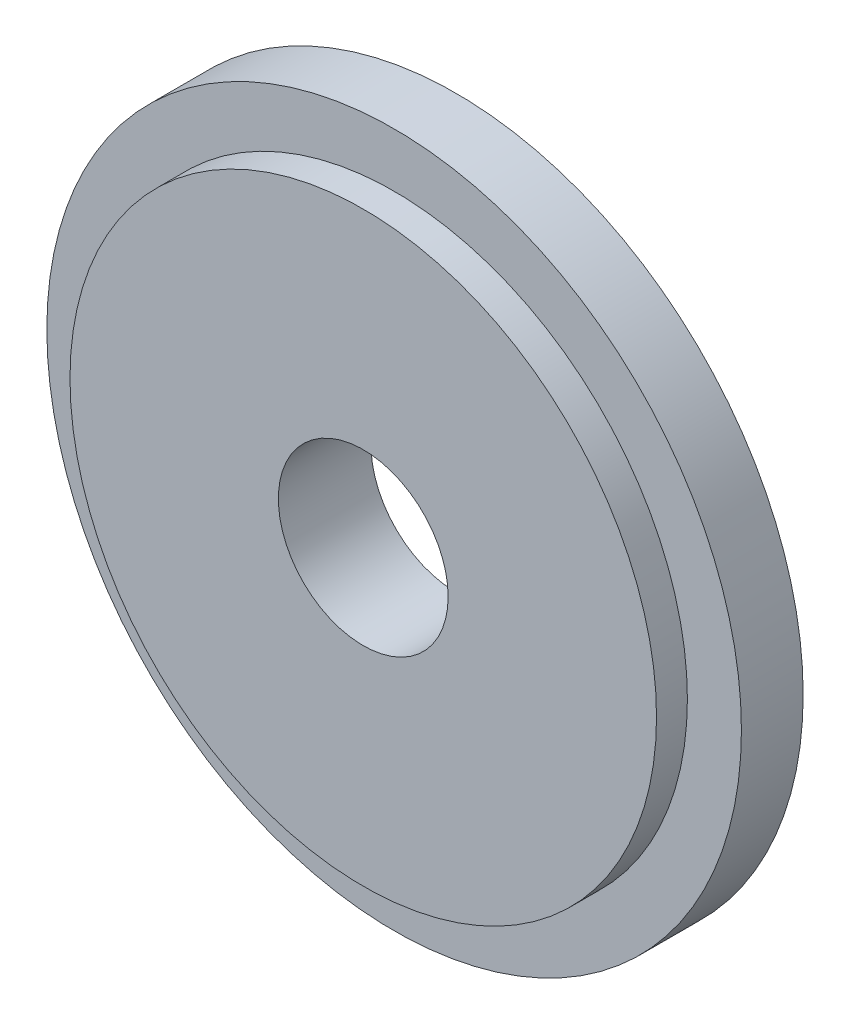
ISO-10303-21;
HEADER;
FILE_DESCRIPTION(('STEP AP214'),'2;1');
FILE_NAME('part.step','',(''),(''),'','','');
FILE_SCHEMA(('AUTOMOTIVE_DESIGN { 1 0 10303 214 1 1 1 1 }'));
ENDSEC;
DATA;
#1=APPLICATION_CONTEXT('core data for automotive mechanical design processes');
#2=APPLICATION_PROTOCOL_DEFINITION('international standard','automotive_design',2000,#1);
#3=PRODUCT_CONTEXT('',#1,'mechanical');
#4=PRODUCT('Part','Part','',(#3));
#5=PRODUCT_RELATED_PRODUCT_CATEGORY('part','',(#4));
#6=PRODUCT_DEFINITION_FORMATION('','',#4);
#7=PRODUCT_DEFINITION_CONTEXT('part definition',#1,'design');
#8=PRODUCT_DEFINITION('design','',#6,#7);
#9=PRODUCT_DEFINITION_SHAPE('','',#8);
#10=(LENGTH_UNIT() NAMED_UNIT(*) SI_UNIT(.MILLI.,.METRE.));
#11=(NAMED_UNIT(*) PLANE_ANGLE_UNIT() SI_UNIT($,.RADIAN.));
#12=(NAMED_UNIT(*) SI_UNIT($,.STERADIAN.) SOLID_ANGLE_UNIT());
#13=UNCERTAINTY_MEASURE_WITH_UNIT(LENGTH_MEASURE(1.E-05),#10,'distance_accuracy_value','');
#14=(GEOMETRIC_REPRESENTATION_CONTEXT(3) GLOBAL_UNCERTAINTY_ASSIGNED_CONTEXT((#13)) GLOBAL_UNIT_ASSIGNED_CONTEXT((#10,
#11,#12)) REPRESENTATION_CONTEXT('',''));
#15=CARTESIAN_POINT('',(0.,0.,0.));
#16=DIRECTION('',(0.,0.,1.));
#17=DIRECTION('',(1.,0.,0.));
#18=AXIS2_PLACEMENT_3D('',#15,#16,#17);
#19=CARTESIAN_POINT('',(0.,0.,4.));
#20=DIRECTION('',(0.,0.,1.));
#21=DIRECTION('',(1.,0.,0.));
#22=AXIS2_PLACEMENT_3D('',#19,#20,#21);
#23=PLANE('',#22);
#24=CARTESIAN_POINT('',(0.,0.,4.));
#25=DIRECTION('',(0.,0.,1.));
#26=DIRECTION('',(1.,0.,0.));
#27=AXIS2_PLACEMENT_3D('',#24,#25,#26);
#28=CIRCLE('',#27,22.5);
#29=CARTESIAN_POINT('',(22.5,0.,4.));
#30=VERTEX_POINT('',#29);
#31=EDGE_CURVE('E10',#30,#30,#28,.T.);
#32=ORIENTED_EDGE('',*,*,#31,.T.);
#33=EDGE_LOOP('',(#32));
#34=FACE_BOUND('',#33,.T.);
#35=CARTESIAN_POINT('',(0.,0.,4.));
#36=DIRECTION('',(0.,0.,1.));
#37=DIRECTION('',(1.,0.,0.));
#38=AXIS2_PLACEMENT_3D('',#35,#36,#37);
#39=CIRCLE('',#38,19.);
#40=CARTESIAN_POINT('',(19.,0.,4.));
#41=VERTEX_POINT('',#40);
#42=EDGE_CURVE('E43',#41,#41,#39,.T.);
#43=ORIENTED_EDGE('',*,*,#42,.F.);
#44=EDGE_LOOP('',(#43));
#45=FACE_BOUND('',#44,.T.);
#46=ADVANCED_FACE('F30',(#34,#45),#23,.T.);
#47=CARTESIAN_POINT('',(0.,0.,4.));
#48=DIRECTION('',(0.,0.,-1.));
#49=DIRECTION('',(-1.,0.,0.));
#50=AXIS2_PLACEMENT_3D('',#47,#48,#49);
#51=CYLINDRICAL_SURFACE('',#50,22.5);
#52=ORIENTED_EDGE('',*,*,#31,.F.);
#53=EDGE_LOOP('',(#52));
#54=FACE_BOUND('',#53,.T.);
#55=CARTESIAN_POINT('',(0.,0.,0.));
#56=DIRECTION('',(0.,0.,1.));
#57=DIRECTION('',(1.,0.,0.));
#58=AXIS2_PLACEMENT_3D('',#55,#56,#57);
#59=CIRCLE('',#58,22.5);
#60=CARTESIAN_POINT('',(22.5,0.,0.));
#61=VERTEX_POINT('',#60);
#62=EDGE_CURVE('E34',#61,#61,#59,.T.);
#63=ORIENTED_EDGE('',*,*,#62,.T.);
#64=EDGE_LOOP('',(#63));
#65=FACE_BOUND('',#64,.T.);
#66=ADVANCED_FACE('F32',(#54,#65),#51,.T.);
#67=CARTESIAN_POINT('',(0.,0.,0.));
#68=DIRECTION('',(0.,0.,1.));
#69=DIRECTION('',(1.,0.,0.));
#70=AXIS2_PLACEMENT_3D('',#67,#68,#69);
#71=PLANE('',#70);
#72=CARTESIAN_POINT('',(0.,0.,0.));
#73=DIRECTION('',(0.,0.,1.));
#74=DIRECTION('',(1.,0.,0.));
#75=AXIS2_PLACEMENT_3D('',#72,#73,#74);
#76=CIRCLE('',#75,5.5);
#77=CARTESIAN_POINT('',(5.5,0.,0.));
#78=VERTEX_POINT('',#77);
#79=EDGE_CURVE('E46',#78,#78,#76,.T.);
#80=ORIENTED_EDGE('',*,*,#79,.T.);
#81=EDGE_LOOP('',(#80));
#82=FACE_BOUND('',#81,.T.);
#83=ORIENTED_EDGE('',*,*,#62,.F.);
#84=EDGE_LOOP('',(#83));
#85=FACE_BOUND('',#84,.T.);
#86=ADVANCED_FACE('F55',(#82,#85),#71,.F.);
#87=CARTESIAN_POINT('',(0.,0.,6.));
#88=DIRECTION('',(0.,0.,-1.));
#89=DIRECTION('',(-1.,0.,0.));
#90=AXIS2_PLACEMENT_3D('',#87,#88,#89);
#91=CYLINDRICAL_SURFACE('',#90,19.);
#92=CARTESIAN_POINT('',(0.,0.,6.));
#93=DIRECTION('',(0.,0.,1.));
#94=DIRECTION('',(1.,0.,0.));
#95=AXIS2_PLACEMENT_3D('',#92,#93,#94);
#96=CIRCLE('',#95,19.);
#97=CARTESIAN_POINT('',(19.,0.,6.));
#98=VERTEX_POINT('',#97);
#99=EDGE_CURVE('E41',#98,#98,#96,.T.);
#100=ORIENTED_EDGE('',*,*,#99,.F.);
#101=EDGE_LOOP('',(#100));
#102=FACE_BOUND('',#101,.T.);
#103=ORIENTED_EDGE('',*,*,#42,.T.);
#104=EDGE_LOOP('',(#103));
#105=FACE_BOUND('',#104,.T.);
#106=ADVANCED_FACE('F67',(#102,#105),#91,.T.);
#107=CARTESIAN_POINT('',(0.,0.,6.));
#108=DIRECTION('',(0.,0.,1.));
#109=DIRECTION('',(1.,0.,0.));
#110=AXIS2_PLACEMENT_3D('',#107,#108,#109);
#111=PLANE('',#110);
#112=CARTESIAN_POINT('',(0.,0.,6.));
#113=DIRECTION('',(0.,0.,1.));
#114=DIRECTION('',(1.,0.,0.));
#115=AXIS2_PLACEMENT_3D('',#112,#113,#114);
#116=CIRCLE('',#115,5.5);
#117=CARTESIAN_POINT('',(5.5,0.,6.));
#118=VERTEX_POINT('',#117);
#119=EDGE_CURVE('E49',#118,#118,#116,.T.);
#120=ORIENTED_EDGE('',*,*,#119,.F.);
#121=EDGE_LOOP('',(#120));
#122=FACE_BOUND('',#121,.T.);
#123=ORIENTED_EDGE('',*,*,#99,.T.);
#124=EDGE_LOOP('',(#123));
#125=FACE_BOUND('',#124,.T.);
#126=ADVANCED_FACE('F61',(#122,#125),#111,.T.);
#127=CARTESIAN_POINT('',(0.,0.,0.));
#128=DIRECTION('',(0.,0.,1.));
#129=DIRECTION('',(1.,0.,0.));
#130=AXIS2_PLACEMENT_3D('',#127,#128,#129);
#131=CYLINDRICAL_SURFACE('',#130,5.5);
#132=ORIENTED_EDGE('',*,*,#79,.F.);
#133=EDGE_LOOP('',(#132));
#134=FACE_BOUND('',#133,.T.);
#135=ORIENTED_EDGE('',*,*,#119,.T.);
#136=EDGE_LOOP('',(#135));
#137=FACE_BOUND('',#136,.T.);
#138=ADVANCED_FACE('F58',(#134,#137),#131,.F.);
#139=CLOSED_SHELL('',(#46,#66,#86,#106,#126,#138));
#140=MANIFOLD_SOLID_BREP('B2',#139);
#141=ADVANCED_BREP_SHAPE_REPRESENTATION('',(#18,#140),#14);
#142=SHAPE_DEFINITION_REPRESENTATION(#9,#141);
ENDSEC;
END-ISO-10303-21;
